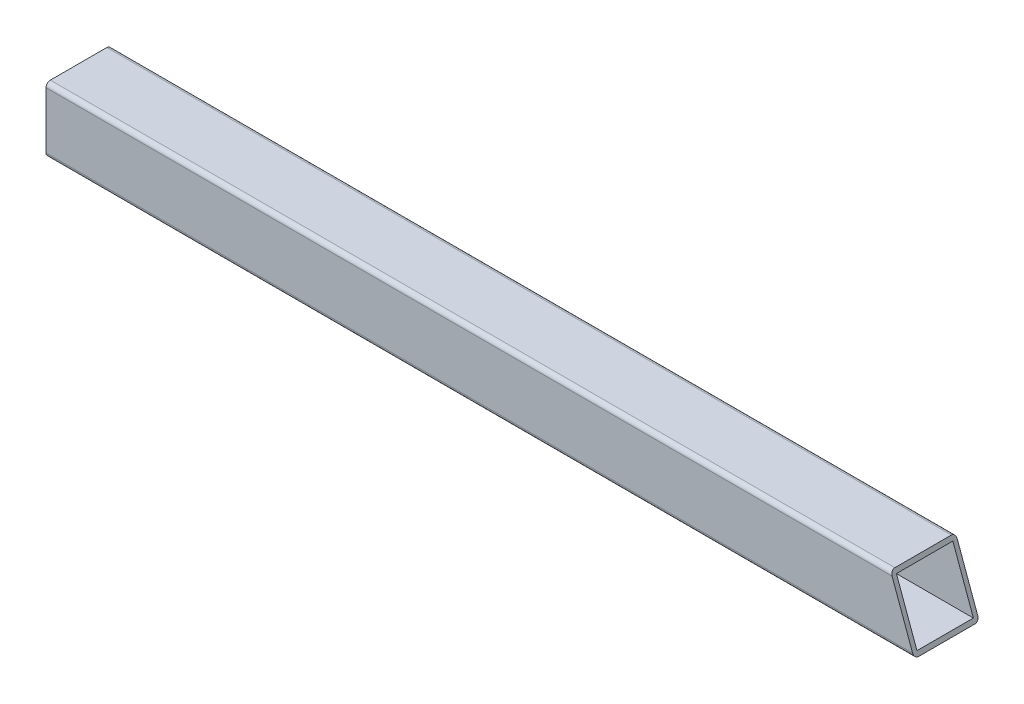
ISO-10303-21;
HEADER;
FILE_DESCRIPTION(('STEP AP214'),'2;1');
FILE_NAME('part.step','',(''),(''),'','','');
FILE_SCHEMA(('AUTOMOTIVE_DESIGN { 1 0 10303 214 1 1 1 1 }'));
ENDSEC;
DATA;
#1=APPLICATION_CONTEXT('core data for automotive mechanical design processes');
#2=APPLICATION_PROTOCOL_DEFINITION('international standard','automotive_design',2000,#1);
#3=PRODUCT_CONTEXT('',#1,'mechanical');
#4=PRODUCT('Part','Part','',(#3));
#5=PRODUCT_RELATED_PRODUCT_CATEGORY('part','',(#4));
#6=PRODUCT_DEFINITION_FORMATION('','',#4);
#7=PRODUCT_DEFINITION_CONTEXT('part definition',#1,'design');
#8=PRODUCT_DEFINITION('design','',#6,#7);
#9=PRODUCT_DEFINITION_SHAPE('','',#8);
#10=(LENGTH_UNIT() NAMED_UNIT(*) SI_UNIT(.MILLI.,.METRE.));
#11=(NAMED_UNIT(*) PLANE_ANGLE_UNIT() SI_UNIT($,.RADIAN.));
#12=(NAMED_UNIT(*) SI_UNIT($,.STERADIAN.) SOLID_ANGLE_UNIT());
#13=UNCERTAINTY_MEASURE_WITH_UNIT(LENGTH_MEASURE(1.E-05),#10,'distance_accuracy_value','');
#14=(GEOMETRIC_REPRESENTATION_CONTEXT(3) GLOBAL_UNCERTAINTY_ASSIGNED_CONTEXT((#13)) GLOBAL_UNIT_ASSIGNED_CONTEXT((#10,
#11,#12)) REPRESENTATION_CONTEXT('',''));
#15=CARTESIAN_POINT('',(0.,0.,0.));
#16=DIRECTION('',(0.,0.,1.));
#17=DIRECTION('',(1.,0.,0.));
#18=AXIS2_PLACEMENT_3D('',#15,#16,#17);
#19=CARTESIAN_POINT('',(-4.44089209850063E-13,140.,-9.99999999999998));
#20=DIRECTION('',(-1.,0.,0.));
#21=DIRECTION('',(0.,0.,1.));
#22=AXIS2_PLACEMENT_3D('',#19,#20,#21);
#23=PLANE('',#22);
#24=CARTESIAN_POINT('',(-4.44089209850063E-13,140.,-9.99999999999998));
#25=DIRECTION('',(1.,0.,0.));
#26=DIRECTION('',(0.,0.,1.));
#27=AXIS2_PLACEMENT_3D('',#24,#25,#26);
#28=CIRCLE('',#27,10.);
#29=CARTESIAN_POINT('',(-4.44089209850063E-13,150.,-10.));
#30=VERTEX_POINT('',#29);
#31=CARTESIAN_POINT('',(-4.44089209850063E-13,140.,0.));
#32=VERTEX_POINT('',#31);
#33=EDGE_CURVE('E170',#30,#32,#28,.T.);
#34=ORIENTED_EDGE('',*,*,#33,.F.);
#35=DIRECTION('',(0.,0.,1.));
#36=VECTOR('',#35,1.);
#37=CARTESIAN_POINT('',(-4.44089209850063E-13,150.,-10.));
#38=LINE('',#37,#36);
#39=CARTESIAN_POINT('',(-4.44089209850063E-13,150.,-140.));
#40=VERTEX_POINT('',#39);
#41=EDGE_CURVE('E141',#40,#30,#38,.T.);
#42=ORIENTED_EDGE('',*,*,#41,.F.);
#43=CARTESIAN_POINT('',(-4.44089209850063E-13,140.,-140.));
#44=DIRECTION('',(1.,0.,0.));
#45=DIRECTION('',(0.,0.,-1.));
#46=AXIS2_PLACEMENT_3D('',#43,#44,#45);
#47=CIRCLE('',#46,10.);
#48=CARTESIAN_POINT('',(-4.44089209850063E-13,140.000000000001,-150.));
#49=VERTEX_POINT('',#48);
#50=EDGE_CURVE('E189',#49,#40,#47,.T.);
#51=ORIENTED_EDGE('',*,*,#50,.F.);
#52=DIRECTION('',(0.,1.,0.));
#53=VECTOR('',#52,1.);
#54=CARTESIAN_POINT('',(0.,10.0000000000009,-150.));
#55=LINE('',#54,#53);
#56=CARTESIAN_POINT('',(0.,10.0000000000009,-150.));
#57=VERTEX_POINT('',#56);
#58=EDGE_CURVE('E186',#57,#49,#55,.T.);
#59=ORIENTED_EDGE('',*,*,#58,.F.);
#60=CARTESIAN_POINT('',(0.,10.,-140.));
#61=DIRECTION('',(1.,0.,0.));
#62=DIRECTION('',(0.,0.,-1.));
#63=AXIS2_PLACEMENT_3D('',#60,#61,#62);
#64=CIRCLE('',#63,10.);
#65=CARTESIAN_POINT('',(0.,0.,-140.));
#66=VERTEX_POINT('',#65);
#67=EDGE_CURVE('E183',#66,#57,#64,.T.);
#68=ORIENTED_EDGE('',*,*,#67,.F.);
#69=DIRECTION('',(0.,0.,-1.));
#70=VECTOR('',#69,1.);
#71=CARTESIAN_POINT('',(0.,0.,-10.0000000000001));
#72=LINE('',#71,#70);
#73=CARTESIAN_POINT('',(0.,0.,-10.0000000000001));
#74=VERTEX_POINT('',#73);
#75=EDGE_CURVE('E181',#74,#66,#72,.T.);
#76=ORIENTED_EDGE('',*,*,#75,.F.);
#77=CARTESIAN_POINT('',(0.,10.,-10.));
#78=DIRECTION('',(1.,0.,0.));
#79=DIRECTION('',(0.,0.,1.));
#80=AXIS2_PLACEMENT_3D('',#77,#78,#79);
#81=CIRCLE('',#80,10.);
#82=CARTESIAN_POINT('',(0.,10.0000000000001,0.));
#83=VERTEX_POINT('',#82);
#84=EDGE_CURVE('E172',#83,#74,#81,.T.);
#85=ORIENTED_EDGE('',*,*,#84,.F.);
#86=DIRECTION('',(0.,-1.,0.));
#87=VECTOR('',#86,1.);
#88=CARTESIAN_POINT('',(0.,10.0000000000001,0.));
#89=LINE('',#88,#87);
#90=EDGE_CURVE('E166',#32,#83,#89,.T.);
#91=ORIENTED_EDGE('',*,*,#90,.F.);
#92=EDGE_LOOP('',(#34,#42,#51,#59,#68,#76,#85,#91));
#93=FACE_BOUND('',#92,.T.);
#94=DIRECTION('',(0.,-1.,0.));
#95=VECTOR('',#94,1.);
#96=CARTESIAN_POINT('',(0.,10.,-10.));
#97=LINE('',#96,#95);
#98=CARTESIAN_POINT('',(-4.44089209850063E-13,140.,-9.99999999999998));
#99=VERTEX_POINT('',#98);
#100=CARTESIAN_POINT('',(0.,10.,-10.));
#101=VERTEX_POINT('',#100);
#102=EDGE_CURVE('E228',#99,#101,#97,.T.);
#103=ORIENTED_EDGE('',*,*,#102,.T.);
#104=DIRECTION('',(0.,0.,-1.));
#105=VECTOR('',#104,1.);
#106=CARTESIAN_POINT('',(0.,10.,-10.));
#107=LINE('',#106,#105);
#108=CARTESIAN_POINT('',(0.,10.,-140.));
#109=VERTEX_POINT('',#108);
#110=EDGE_CURVE('E136',#101,#109,#107,.T.);
#111=ORIENTED_EDGE('',*,*,#110,.T.);
#112=DIRECTION('',(0.,1.,0.));
#113=VECTOR('',#112,1.);
#114=CARTESIAN_POINT('',(0.,10.,-140.));
#115=LINE('',#114,#113);
#116=CARTESIAN_POINT('',(-4.44089209850063E-13,140.,-140.));
#117=VERTEX_POINT('',#116);
#118=EDGE_CURVE('E222',#109,#117,#115,.T.);
#119=ORIENTED_EDGE('',*,*,#118,.T.);
#120=DIRECTION('',(0.,0.,1.));
#121=VECTOR('',#120,1.);
#122=CARTESIAN_POINT('',(-4.44089209850063E-13,140.,-9.99999999999998));
#123=LINE('',#122,#121);
#124=EDGE_CURVE('E225',#117,#99,#123,.T.);
#125=ORIENTED_EDGE('',*,*,#124,.T.);
#126=EDGE_LOOP('',(#103,#111,#119,#125));
#127=FACE_BOUND('',#126,.T.);
#128=ADVANCED_FACE('F34',(#93,#127),#23,.T.);
#129=CARTESIAN_POINT('',(2000.,139.999999999996,-10.0000000000009));
#130=DIRECTION('',(-1.,0.,0.));
#131=DIRECTION('',(0.,0.,1.));
#132=AXIS2_PLACEMENT_3D('',#129,#130,#131);
#133=CYLINDRICAL_SURFACE('',#132,10.);
#134=DIRECTION('',(-1.,0.,0.));
#135=VECTOR('',#134,1.);
#136=CARTESIAN_POINT('',(2000.,139.999999999995,-8.60422844084496E-13));
#137=LINE('',#136,#135);
#138=CARTESIAN_POINT('',(1949.04416720273,139.999999999995,-1.36002320516582E-12));
#139=VERTEX_POINT('',#138);
#140=EDGE_CURVE('E42',#139,#32,#137,.T.);
#141=ORIENTED_EDGE('',*,*,#140,.F.);
#142=CARTESIAN_POINT('',(1949.04416720273,139.999999999996,-10.0000000000014));
#143=DIRECTION('',(-0.939692620785908,-0.342020143325661,0.));
#144=DIRECTION('',(-0.342020143325666,0.939692620785912,0.));
#145=AXIS2_PLACEMENT_3D('',#142,#143,#144);
#146=ELLIPSE('',#145,10.6417777247591,10.);
#147=CARTESIAN_POINT('',(1945.40446486007,149.999999999996,-10.0000000000016));
#148=VERTEX_POINT('',#147);
#149=EDGE_CURVE('E124',#139,#148,#146,.T.);
#150=ORIENTED_EDGE('',*,*,#149,.T.);
#151=DIRECTION('',(-1.,0.,0.));
#152=VECTOR('',#151,1.);
#153=CARTESIAN_POINT('',(2000.,149.999999999996,-10.0000000000009));
#154=LINE('',#153,#152);
#155=EDGE_CURVE('E134',#148,#30,#154,.T.);
#156=ORIENTED_EDGE('',*,*,#155,.T.);
#157=ORIENTED_EDGE('',*,*,#33,.T.);
#158=EDGE_LOOP('',(#141,#150,#156,#157));
#159=FACE_BOUND('',#158,.T.);
#160=ADVANCED_FACE('F36',(#159),#133,.T.);
#161=CARTESIAN_POINT('',(2000.,9.99999999999479,-8.88178419700125E-13));
#162=DIRECTION('',(0.,0.,-1.));
#163=DIRECTION('',(-1.,0.,0.));
#164=AXIS2_PLACEMENT_3D('',#161,#162,#163);
#165=PLANE('',#164);
#166=DIRECTION('',(-1.,0.,0.));
#167=VECTOR('',#166,1.);
#168=CARTESIAN_POINT('',(2000.,9.99999999999479,-8.88178419700125E-13));
#169=LINE('',#168,#167);
#170=CARTESIAN_POINT('',(1996.36029765734,9.99999999999479,-8.88178419700125E-13));
#171=VERTEX_POINT('',#170);
#172=EDGE_CURVE('E160',#171,#83,#169,.T.);
#173=ORIENTED_EDGE('',*,*,#172,.F.);
#174=DIRECTION('',(-0.342020143325666,0.939692620785912,0.));
#175=VECTOR('',#174,1.);
#176=CARTESIAN_POINT('',(1996.78606195157,8.83022221558971,-8.88178419700125E-13));
#177=LINE('',#176,#175);
#178=EDGE_CURVE('E137',#171,#139,#177,.T.);
#179=ORIENTED_EDGE('',*,*,#178,.T.);
#180=ORIENTED_EDGE('',*,*,#140,.T.);
#181=ORIENTED_EDGE('',*,*,#90,.T.);
#182=EDGE_LOOP('',(#173,#179,#180,#181));
#183=FACE_BOUND('',#182,.T.);
#184=ADVANCED_FACE('F165',(#183),#165,.F.);
#185=CARTESIAN_POINT('',(2000.,9.99999999999468,-10.0000000000009));
#186=DIRECTION('',(-1.,0.,0.));
#187=DIRECTION('',(0.,0.,1.));
#188=AXIS2_PLACEMENT_3D('',#185,#186,#187);
#189=CYLINDRICAL_SURFACE('',#188,10.);
#190=DIRECTION('',(-1.,0.,0.));
#191=VECTOR('',#190,1.);
#192=CARTESIAN_POINT('',(2000.,-5.32907051820075E-12,-10.000000000001));
#193=LINE('',#192,#191);
#194=CARTESIAN_POINT('',(2000.,-5.32907051820075E-12,-10.0000000000011));
#195=VERTEX_POINT('',#194);
#196=EDGE_CURVE('E157',#195,#74,#193,.T.);
#197=ORIENTED_EDGE('',*,*,#196,.F.);
#198=CARTESIAN_POINT('',(1996.36029765734,9.99999999999468,-10.0000000000009));
#199=DIRECTION('',(-0.939692620785908,-0.342020143325661,0.));
#200=DIRECTION('',(-0.342020143325666,0.939692620785912,0.));
#201=AXIS2_PLACEMENT_3D('',#198,#199,#200);
#202=ELLIPSE('',#201,10.6417777247591,10.);
#203=EDGE_CURVE('E214',#195,#171,#202,.T.);
#204=ORIENTED_EDGE('',*,*,#203,.T.);
#205=ORIENTED_EDGE('',*,*,#172,.T.);
#206=ORIENTED_EDGE('',*,*,#84,.T.);
#207=EDGE_LOOP('',(#197,#204,#205,#206));
#208=FACE_BOUND('',#207,.T.);
#209=ADVANCED_FACE('F213',(#208),#189,.T.);
#210=CARTESIAN_POINT('',(2000.,-5.32907051820075E-12,-10.000000000001));
#211=DIRECTION('',(0.,1.,0.));
#212=DIRECTION('',(0.,0.,1.));
#213=AXIS2_PLACEMENT_3D('',#210,#211,#212);
#214=PLANE('',#213);
#215=ORIENTED_EDGE('',*,*,#75,.T.);
#216=DIRECTION('',(-1.,0.,0.));
#217=VECTOR('',#216,1.);
#218=CARTESIAN_POINT('',(2000.,-5.32907051820075E-12,-140.000000000001));
#219=LINE('',#218,#217);
#220=CARTESIAN_POINT('',(2000.,-5.32907051820075E-12,-140.000000000001));
#221=VERTEX_POINT('',#220);
#222=EDGE_CURVE('E154',#221,#66,#219,.T.);
#223=ORIENTED_EDGE('',*,*,#222,.F.);
#224=DIRECTION('',(0.,0.,-1.));
#225=VECTOR('',#224,1.);
#226=CARTESIAN_POINT('',(2000.,-5.32907051820075E-12,-10.000000000001));
#227=LINE('',#226,#225);
#228=EDGE_CURVE('E144',#195,#221,#227,.T.);
#229=ORIENTED_EDGE('',*,*,#228,.F.);
#230=ORIENTED_EDGE('',*,*,#196,.T.);
#231=EDGE_LOOP('',(#215,#223,#229,#230));
#232=FACE_BOUND('',#231,.T.);
#233=ADVANCED_FACE('F209',(#232),#214,.F.);
#234=CARTESIAN_POINT('',(2000.,9.99999999999468,-140.000000000001));
#235=DIRECTION('',(-1.,0.,0.));
#236=DIRECTION('',(0.,0.,1.));
#237=AXIS2_PLACEMENT_3D('',#234,#235,#236);
#238=CYLINDRICAL_SURFACE('',#237,10.);
#239=DIRECTION('',(-1.,0.,0.));
#240=VECTOR('',#239,1.);
#241=CARTESIAN_POINT('',(2000.,9.99999999999557,-150.000000000001));
#242=LINE('',#241,#240);
#243=CARTESIAN_POINT('',(1996.36029765734,9.99999999999557,-150.000000000001));
#244=VERTEX_POINT('',#243);
#245=EDGE_CURVE('E152',#244,#57,#242,.T.);
#246=ORIENTED_EDGE('',*,*,#245,.F.);
#247=CARTESIAN_POINT('',(1996.36029765734,9.99999999999468,-140.000000000001));
#248=DIRECTION('',(-0.939692620785908,-0.342020143325661,0.));
#249=DIRECTION('',(-0.342020143325666,0.939692620785912,0.));
#250=AXIS2_PLACEMENT_3D('',#247,#248,#249);
#251=ELLIPSE('',#250,10.6417777247591,10.);
#252=EDGE_CURVE('E206',#244,#221,#251,.T.);
#253=ORIENTED_EDGE('',*,*,#252,.T.);
#254=ORIENTED_EDGE('',*,*,#222,.T.);
#255=ORIENTED_EDGE('',*,*,#67,.T.);
#256=EDGE_LOOP('',(#246,#253,#254,#255));
#257=FACE_BOUND('',#256,.T.);
#258=ADVANCED_FACE('F204',(#257),#238,.T.);
#259=CARTESIAN_POINT('',(2000.,9.99999999999557,-150.000000000001));
#260=DIRECTION('',(0.,0.,1.));
#261=DIRECTION('',(1.,0.,0.));
#262=AXIS2_PLACEMENT_3D('',#259,#260,#261);
#263=PLANE('',#262);
#264=DIRECTION('',(-1.,0.,0.));
#265=VECTOR('',#264,1.);
#266=CARTESIAN_POINT('',(2000.,139.999999999996,-150.000000000001));
#267=LINE('',#266,#265);
#268=CARTESIAN_POINT('',(1949.04416720273,139.999999999996,-150.000000000001));
#269=VERTEX_POINT('',#268);
#270=EDGE_CURVE('E146',#269,#49,#267,.T.);
#271=ORIENTED_EDGE('',*,*,#270,.F.);
#272=DIRECTION('',(0.342020143325666,-0.939692620785912,0.));
#273=VECTOR('',#272,1.);
#274=CARTESIAN_POINT('',(1996.78606195157,8.83022221559049,-150.000000000001));
#275=LINE('',#274,#273);
#276=EDGE_CURVE('E201',#269,#244,#275,.T.);
#277=ORIENTED_EDGE('',*,*,#276,.T.);
#278=ORIENTED_EDGE('',*,*,#245,.T.);
#279=ORIENTED_EDGE('',*,*,#58,.T.);
#280=EDGE_LOOP('',(#271,#277,#278,#279));
#281=FACE_BOUND('',#280,.T.);
#282=ADVANCED_FACE('F198',(#281),#263,.F.);
#283=CARTESIAN_POINT('',(2000.,139.999999999995,-140.000000000001));
#284=DIRECTION('',(-1.,0.,0.));
#285=DIRECTION('',(0.,0.,1.));
#286=AXIS2_PLACEMENT_3D('',#283,#284,#285);
#287=CYLINDRICAL_SURFACE('',#286,10.);
#288=DIRECTION('',(-1.,0.,0.));
#289=VECTOR('',#288,1.);
#290=CARTESIAN_POINT('',(2000.,149.999999999995,-140.000000000001));
#291=LINE('',#290,#289);
#292=CARTESIAN_POINT('',(1945.40446486007,149.999999999995,-140.));
#293=VERTEX_POINT('',#292);
#294=EDGE_CURVE('E143',#293,#40,#291,.T.);
#295=ORIENTED_EDGE('',*,*,#294,.F.);
#296=CARTESIAN_POINT('',(1949.04416720273,139.999999999995,-140.000000000001));
#297=DIRECTION('',(-0.939692620785908,-0.342020143325661,0.));
#298=DIRECTION('',(-0.342020143325666,0.939692620785912,0.));
#299=AXIS2_PLACEMENT_3D('',#296,#297,#298);
#300=ELLIPSE('',#299,10.6417777247591,10.);
#301=EDGE_CURVE('E49',#293,#269,#300,.T.);
#302=ORIENTED_EDGE('',*,*,#301,.T.);
#303=ORIENTED_EDGE('',*,*,#270,.T.);
#304=ORIENTED_EDGE('',*,*,#50,.T.);
#305=EDGE_LOOP('',(#295,#302,#303,#304));
#306=FACE_BOUND('',#305,.T.);
#307=ADVANCED_FACE('F193',(#306),#287,.T.);
#308=CARTESIAN_POINT('',(2000.,149.999999999996,-10.0000000000009));
#309=DIRECTION('',(0.,-1.,0.));
#310=DIRECTION('',(0.,0.,-1.));
#311=AXIS2_PLACEMENT_3D('',#308,#309,#310);
#312=PLANE('',#311);
#313=ORIENTED_EDGE('',*,*,#155,.F.);
#314=DIRECTION('',(0.,0.,-1.));
#315=VECTOR('',#314,1.);
#316=CARTESIAN_POINT('',(1945.40446486007,149.999999999999,2514.02317013985));
#317=LINE('',#316,#315);
#318=EDGE_CURVE('E121',#148,#293,#317,.T.);
#319=ORIENTED_EDGE('',*,*,#318,.T.);
#320=ORIENTED_EDGE('',*,*,#294,.T.);
#321=ORIENTED_EDGE('',*,*,#41,.T.);
#322=EDGE_LOOP('',(#313,#319,#320,#321));
#323=FACE_BOUND('',#322,.T.);
#324=ADVANCED_FACE('F139',(#323),#312,.F.);
#325=CARTESIAN_POINT('',(2000.,9.99999999999468,-10.0000000000009));
#326=DIRECTION('',(0.,1.,0.));
#327=DIRECTION('',(0.,0.,1.));
#328=AXIS2_PLACEMENT_3D('',#325,#326,#327);
#329=PLANE('',#328);
#330=DIRECTION('',(0.,0.,1.));
#331=VECTOR('',#330,1.);
#332=CARTESIAN_POINT('',(1996.36029765734,9.99999999999468,-10.0000000000009));
#333=LINE('',#332,#331);
#334=CARTESIAN_POINT('',(1996.36029765734,9.99999999999468,-140.000000000001));
#335=VERTEX_POINT('',#334);
#336=CARTESIAN_POINT('',(1996.36029765734,9.99999999999468,-10.0000000000009));
#337=VERTEX_POINT('',#336);
#338=EDGE_CURVE('E57',#335,#337,#333,.T.);
#339=ORIENTED_EDGE('',*,*,#338,.F.);
#340=DIRECTION('',(-1.,0.,0.));
#341=VECTOR('',#340,1.);
#342=CARTESIAN_POINT('',(2000.,9.99999999999468,-140.000000000001));
#343=LINE('',#342,#341);
#344=EDGE_CURVE('E174',#335,#109,#343,.T.);
#345=ORIENTED_EDGE('',*,*,#344,.T.);
#346=ORIENTED_EDGE('',*,*,#110,.F.);
#347=DIRECTION('',(-1.,0.,0.));
#348=VECTOR('',#347,1.);
#349=CARTESIAN_POINT('',(2000.,9.99999999999468,-10.0000000000009));
#350=LINE('',#349,#348);
#351=EDGE_CURVE('E231',#337,#101,#350,.T.);
#352=ORIENTED_EDGE('',*,*,#351,.F.);
#353=EDGE_LOOP('',(#339,#345,#346,#352));
#354=FACE_BOUND('',#353,.T.);
#355=ADVANCED_FACE('F247',(#354),#329,.T.);
#356=CARTESIAN_POINT('',(2000.,9.99999999999468,-140.000000000001));
#357=DIRECTION('',(0.,0.,1.));
#358=DIRECTION('',(1.,0.,0.));
#359=AXIS2_PLACEMENT_3D('',#356,#357,#358);
#360=PLANE('',#359);
#361=DIRECTION('',(0.342020143325666,-0.939692620785912,0.));
#362=VECTOR('',#361,1.);
#363=CARTESIAN_POINT('',(1996.78606195157,8.8302222155896,-140.000000000001));
#364=LINE('',#363,#362);
#365=CARTESIAN_POINT('',(1949.04416720273,139.999999999995,-140.000000000001));
#366=VERTEX_POINT('',#365);
#367=EDGE_CURVE('E240',#366,#335,#364,.T.);
#368=ORIENTED_EDGE('',*,*,#367,.F.);
#369=DIRECTION('',(-1.,0.,0.));
#370=VECTOR('',#369,1.);
#371=CARTESIAN_POINT('',(2000.,139.999999999995,-140.000000000001));
#372=LINE('',#371,#370);
#373=EDGE_CURVE('E176',#366,#117,#372,.T.);
#374=ORIENTED_EDGE('',*,*,#373,.T.);
#375=ORIENTED_EDGE('',*,*,#118,.F.);
#376=ORIENTED_EDGE('',*,*,#344,.F.);
#377=EDGE_LOOP('',(#368,#374,#375,#376));
#378=FACE_BOUND('',#377,.T.);
#379=ADVANCED_FACE('F238',(#378),#360,.T.);
#380=CARTESIAN_POINT('',(2000.,139.999999999996,-10.0000000000009));
#381=DIRECTION('',(0.,-1.,0.));
#382=DIRECTION('',(0.,0.,-1.));
#383=AXIS2_PLACEMENT_3D('',#380,#381,#382);
#384=PLANE('',#383);
#385=DIRECTION('',(0.,0.,-1.));
#386=VECTOR('',#385,1.);
#387=CARTESIAN_POINT('',(1949.04416720273,139.999999999996,-10.0000000000014));
#388=LINE('',#387,#386);
#389=CARTESIAN_POINT('',(1949.04416720273,139.999999999996,-10.0000000000014));
#390=VERTEX_POINT('',#389);
#391=EDGE_CURVE('E129',#390,#366,#388,.T.);
#392=ORIENTED_EDGE('',*,*,#391,.F.);
#393=DIRECTION('',(-1.,0.,0.));
#394=VECTOR('',#393,1.);
#395=CARTESIAN_POINT('',(2000.,139.999999999996,-10.0000000000009));
#396=LINE('',#395,#394);
#397=EDGE_CURVE('E233',#390,#99,#396,.T.);
#398=ORIENTED_EDGE('',*,*,#397,.T.);
#399=ORIENTED_EDGE('',*,*,#124,.F.);
#400=ORIENTED_EDGE('',*,*,#373,.F.);
#401=EDGE_LOOP('',(#392,#398,#399,#400));
#402=FACE_BOUND('',#401,.T.);
#403=ADVANCED_FACE('F244',(#402),#384,.T.);
#404=CARTESIAN_POINT('',(2000.,9.99999999999468,-10.0000000000009));
#405=DIRECTION('',(0.,0.,-1.));
#406=DIRECTION('',(-1.,0.,0.));
#407=AXIS2_PLACEMENT_3D('',#404,#405,#406);
#408=PLANE('',#407);
#409=DIRECTION('',(-0.342020143325666,0.939692620785912,0.));
#410=VECTOR('',#409,1.);
#411=CARTESIAN_POINT('',(1996.78606195157,8.8302222155896,-10.0000000000009));
#412=LINE('',#411,#410);
#413=EDGE_CURVE('E11',#337,#390,#412,.T.);
#414=ORIENTED_EDGE('',*,*,#413,.F.);
#415=ORIENTED_EDGE('',*,*,#351,.T.);
#416=ORIENTED_EDGE('',*,*,#102,.F.);
#417=ORIENTED_EDGE('',*,*,#397,.F.);
#418=EDGE_LOOP('',(#414,#415,#416,#417));
#419=FACE_BOUND('',#418,.T.);
#420=ADVANCED_FACE('F254',(#419),#408,.T.);
#421=CARTESIAN_POINT('',(2000.,1.33226762955019E-12,2514.02317013985));
#422=DIRECTION('',(-0.939692620785908,-0.342020143325661,0.));
#423=DIRECTION('',(0.342020143325666,-0.939692620785912,0.));
#424=AXIS2_PLACEMENT_3D('',#421,#422,#423);
#425=PLANE('',#424);
#426=ORIENTED_EDGE('',*,*,#367,.T.);
#427=ORIENTED_EDGE('',*,*,#338,.T.);
#428=ORIENTED_EDGE('',*,*,#413,.T.);
#429=ORIENTED_EDGE('',*,*,#391,.T.);
#430=EDGE_LOOP('',(#426,#427,#428,#429));
#431=FACE_BOUND('',#430,.T.);
#432=ORIENTED_EDGE('',*,*,#149,.F.);
#433=ORIENTED_EDGE('',*,*,#178,.F.);
#434=ORIENTED_EDGE('',*,*,#203,.F.);
#435=ORIENTED_EDGE('',*,*,#228,.T.);
#436=ORIENTED_EDGE('',*,*,#252,.F.);
#437=ORIENTED_EDGE('',*,*,#276,.F.);
#438=ORIENTED_EDGE('',*,*,#301,.F.);
#439=ORIENTED_EDGE('',*,*,#318,.F.);
#440=EDGE_LOOP('',(#432,#433,#434,#435,#436,#437,#438,#439));
#441=FACE_BOUND('',#440,.T.);
#442=ADVANCED_FACE('F123',(#431,#441),#425,.F.);
#443=CLOSED_SHELL('',(#128,#160,#184,#209,#233,#258,#282,#307,#324,#355,#379,#403,#420,#442));
#444=MANIFOLD_SOLID_BREP('B2',#443);
#445=ADVANCED_BREP_SHAPE_REPRESENTATION('',(#18,#444),#14);
#446=SHAPE_DEFINITION_REPRESENTATION(#9,#445);
ENDSEC;
END-ISO-10303-21;
